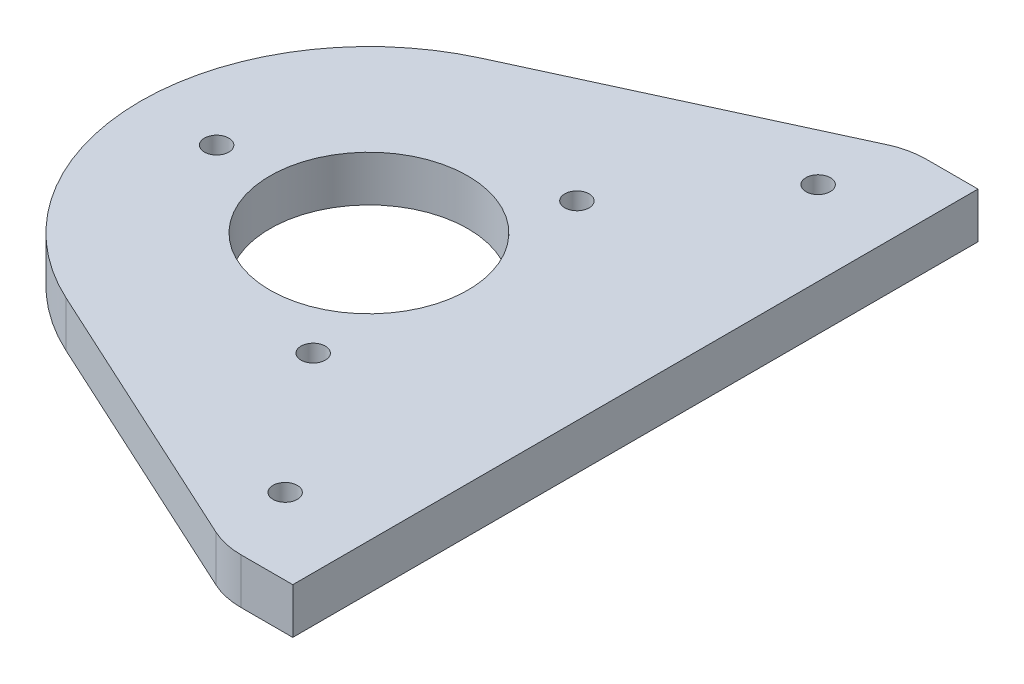
ISO-10303-21;
HEADER;
FILE_DESCRIPTION(('STEP AP214'),'2;1');
FILE_NAME('part.step','',(''),(''),'','','');
FILE_SCHEMA(('AUTOMOTIVE_DESIGN { 1 0 10303 214 1 1 1 1 }'));
ENDSEC;
DATA;
#1=APPLICATION_CONTEXT('core data for automotive mechanical design processes');
#2=APPLICATION_PROTOCOL_DEFINITION('international standard','automotive_design',2000,#1);
#3=PRODUCT_CONTEXT('',#1,'mechanical');
#4=PRODUCT('Part','Part','',(#3));
#5=PRODUCT_RELATED_PRODUCT_CATEGORY('part','',(#4));
#6=PRODUCT_DEFINITION_FORMATION('','',#4);
#7=PRODUCT_DEFINITION_CONTEXT('part definition',#1,'design');
#8=PRODUCT_DEFINITION('design','',#6,#7);
#9=PRODUCT_DEFINITION_SHAPE('','',#8);
#10=(LENGTH_UNIT() NAMED_UNIT(*) SI_UNIT(.MILLI.,.METRE.));
#11=(NAMED_UNIT(*) PLANE_ANGLE_UNIT() SI_UNIT($,.RADIAN.));
#12=(NAMED_UNIT(*) SI_UNIT($,.STERADIAN.) SOLID_ANGLE_UNIT());
#13=UNCERTAINTY_MEASURE_WITH_UNIT(LENGTH_MEASURE(1.E-05),#10,'distance_accuracy_value','');
#14=(GEOMETRIC_REPRESENTATION_CONTEXT(3) GLOBAL_UNCERTAINTY_ASSIGNED_CONTEXT((#13)) GLOBAL_UNIT_ASSIGNED_CONTEXT((#10,
#11,#12)) REPRESENTATION_CONTEXT('',''));
#15=CARTESIAN_POINT('',(0.,0.,0.));
#16=DIRECTION('',(0.,0.,1.));
#17=DIRECTION('',(1.,0.,0.));
#18=AXIS2_PLACEMENT_3D('',#15,#16,#17);
#19=CARTESIAN_POINT('',(-11.2261094095535,6.,0.));
#20=DIRECTION('',(0.,-1.,0.));
#21=DIRECTION('',(0.,0.,-1.));
#22=AXIS2_PLACEMENT_3D('',#19,#20,#21);
#23=CYLINDRICAL_SURFACE('',#22,30.);
#24=CARTESIAN_POINT('',(-11.2261094095535,0.,0.));
#25=DIRECTION('',(0.,1.,0.));
#26=DIRECTION('',(0.,0.,1.));
#27=AXIS2_PLACEMENT_3D('',#24,#25,#26);
#28=CIRCLE('',#27,30.);
#29=CARTESIAN_POINT('',(-23.7738905904465,0.,-27.2498291267382));
#30=VERTEX_POINT('',#29);
#31=CARTESIAN_POINT('',(-23.7738905904465,0.,27.2498291267382));
#32=VERTEX_POINT('',#31);
#33=EDGE_CURVE('E133',#30,#32,#28,.T.);
#34=ORIENTED_EDGE('',*,*,#33,.T.);
#35=DIRECTION('',(0.,-1.,0.));
#36=VECTOR('',#35,1.);
#37=CARTESIAN_POINT('',(-23.7738905904465,6.,27.2498291267382));
#38=LINE('',#37,#36);
#39=CARTESIAN_POINT('',(-23.7738905904465,6.,27.2498291267382));
#40=VERTEX_POINT('',#39);
#41=EDGE_CURVE('E114',#40,#32,#38,.T.);
#42=ORIENTED_EDGE('',*,*,#41,.F.);
#43=CARTESIAN_POINT('',(-11.2261094095535,6.,0.));
#44=DIRECTION('',(0.,1.,0.));
#45=DIRECTION('',(0.,0.,1.));
#46=AXIS2_PLACEMENT_3D('',#43,#44,#45);
#47=CIRCLE('',#46,30.);
#48=CARTESIAN_POINT('',(-23.7738905904465,6.,-27.2498291267382));
#49=VERTEX_POINT('',#48);
#50=EDGE_CURVE('E121',#49,#40,#47,.T.);
#51=ORIENTED_EDGE('',*,*,#50,.F.);
#52=DIRECTION('',(0.,-1.,0.));
#53=VECTOR('',#52,1.);
#54=CARTESIAN_POINT('',(-23.7738905904465,6.,-27.2498291267382));
#55=LINE('',#54,#53);
#56=EDGE_CURVE('E178',#49,#30,#55,.T.);
#57=ORIENTED_EDGE('',*,*,#56,.T.);
#58=EDGE_LOOP('',(#34,#42,#51,#57));
#59=FACE_BOUND('',#58,.T.);
#60=ADVANCED_FACE('F43',(#59),#23,.T.);
#61=CARTESIAN_POINT('',(-23.7738905904465,6.,27.2498291267382));
#62=DIRECTION('',(0.418259372696433,0.,-0.908327637557939));
#63=DIRECTION('',(-0.908327637557939,0.,-0.418259372696433));
#64=AXIS2_PLACEMENT_3D('',#61,#62,#63);
#65=PLANE('',#64);
#66=DIRECTION('',(0.908327637557939,0.,0.418259372696433));
#67=VECTOR('',#66,1.);
#68=CARTESIAN_POINT('',(-23.7738905904465,0.,27.2498291267382));
#69=LINE('',#68,#67);
#70=CARTESIAN_POINT('',(12.7830555765283,0.,44.0832763755794));
#71=VERTEX_POINT('',#70);
#72=EDGE_CURVE('E191',#32,#71,#69,.T.);
#73=ORIENTED_EDGE('',*,*,#72,.T.);
#74=DIRECTION('',(0.,-1.,0.));
#75=VECTOR('',#74,1.);
#76=CARTESIAN_POINT('',(12.7830555765283,6.,44.0832763755794));
#77=LINE('',#76,#75);
#78=CARTESIAN_POINT('',(12.7830555765283,6.,44.0832763755794));
#79=VERTEX_POINT('',#78);
#80=EDGE_CURVE('E117',#71,#79,#77,.F.);
#81=ORIENTED_EDGE('',*,*,#80,.T.);
#82=DIRECTION('',(0.908327637557939,0.,0.418259372696433));
#83=VECTOR('',#82,1.);
#84=CARTESIAN_POINT('',(-23.7738905904465,6.,27.2498291267382));
#85=LINE('',#84,#83);
#86=EDGE_CURVE('E109',#40,#79,#85,.T.);
#87=ORIENTED_EDGE('',*,*,#86,.F.);
#88=ORIENTED_EDGE('',*,*,#41,.T.);
#89=EDGE_LOOP('',(#73,#81,#87,#88));
#90=FACE_BOUND('',#89,.T.);
#91=ADVANCED_FACE('F112',(#90),#65,.F.);
#92=CARTESIAN_POINT('',(14.7738905904465,6.,45.));
#93=DIRECTION('',(0.,0.,-1.));
#94=DIRECTION('',(-1.,0.,0.));
#95=AXIS2_PLACEMENT_3D('',#92,#93,#94);
#96=PLANE('',#95);
#97=DIRECTION('',(1.,0.,0.));
#98=VECTOR('',#97,1.);
#99=CARTESIAN_POINT('',(14.7738905904465,6.,45.));
#100=LINE('',#99,#98);
#101=CARTESIAN_POINT('',(16.9656493034926,6.,45.));
#102=VERTEX_POINT('',#101);
#103=CARTESIAN_POINT('',(23.7738905904465,6.,45.));
#104=VERTEX_POINT('',#103);
#105=EDGE_CURVE('E120',#102,#104,#100,.T.);
#106=ORIENTED_EDGE('',*,*,#105,.F.);
#107=DIRECTION('',(0.,-1.,0.));
#108=VECTOR('',#107,1.);
#109=CARTESIAN_POINT('',(16.9656493034926,6.,45.));
#110=LINE('',#109,#108);
#111=CARTESIAN_POINT('',(16.9656493034926,0.,45.));
#112=VERTEX_POINT('',#111);
#113=EDGE_CURVE('E135',#102,#112,#110,.T.);
#114=ORIENTED_EDGE('',*,*,#113,.T.);
#115=DIRECTION('',(1.,0.,0.));
#116=VECTOR('',#115,1.);
#117=CARTESIAN_POINT('',(14.7738905904465,0.,45.));
#118=LINE('',#117,#116);
#119=CARTESIAN_POINT('',(23.7738905904465,0.,45.));
#120=VERTEX_POINT('',#119);
#121=EDGE_CURVE('E188',#112,#120,#118,.T.);
#122=ORIENTED_EDGE('',*,*,#121,.T.);
#123=DIRECTION('',(0.,-1.,0.));
#124=VECTOR('',#123,1.);
#125=CARTESIAN_POINT('',(23.7738905904465,6.,45.));
#126=LINE('',#125,#124);
#127=EDGE_CURVE('E136',#104,#120,#126,.T.);
#128=ORIENTED_EDGE('',*,*,#127,.F.);
#129=EDGE_LOOP('',(#106,#114,#122,#128));
#130=FACE_BOUND('',#129,.T.);
#131=ADVANCED_FACE('F291',(#130),#96,.F.);
#132=CARTESIAN_POINT('',(23.7738905904465,6.,-45.));
#133=DIRECTION('',(-1.,0.,0.));
#134=DIRECTION('',(0.,0.,1.));
#135=AXIS2_PLACEMENT_3D('',#132,#133,#134);
#136=PLANE('',#135);
#137=DIRECTION('',(0.,0.,-1.));
#138=VECTOR('',#137,1.);
#139=CARTESIAN_POINT('',(23.7738905904465,0.,-45.));
#140=LINE('',#139,#138);
#141=CARTESIAN_POINT('',(23.7738905904465,0.,-45.));
#142=VERTEX_POINT('',#141);
#143=EDGE_CURVE('E174',#120,#142,#140,.T.);
#144=ORIENTED_EDGE('',*,*,#143,.T.);
#145=DIRECTION('',(0.,-1.,0.));
#146=VECTOR('',#145,1.);
#147=CARTESIAN_POINT('',(23.7738905904465,6.,-45.));
#148=LINE('',#147,#146);
#149=CARTESIAN_POINT('',(23.7738905904465,6.,-45.));
#150=VERTEX_POINT('',#149);
#151=EDGE_CURVE('E144',#150,#142,#148,.T.);
#152=ORIENTED_EDGE('',*,*,#151,.F.);
#153=DIRECTION('',(0.,0.,-1.));
#154=VECTOR('',#153,1.);
#155=CARTESIAN_POINT('',(23.7738905904465,6.,-45.));
#156=LINE('',#155,#154);
#157=EDGE_CURVE('E203',#104,#150,#156,.T.);
#158=ORIENTED_EDGE('',*,*,#157,.F.);
#159=ORIENTED_EDGE('',*,*,#127,.T.);
#160=EDGE_LOOP('',(#144,#152,#158,#159));
#161=FACE_BOUND('',#160,.T.);
#162=ADVANCED_FACE('F308',(#161),#136,.F.);
#163=CARTESIAN_POINT('',(23.7738905904465,6.,-45.));
#164=DIRECTION('',(0.,0.,1.));
#165=DIRECTION('',(1.,0.,0.));
#166=AXIS2_PLACEMENT_3D('',#163,#164,#165);
#167=PLANE('',#166);
#168=DIRECTION('',(-1.,0.,0.));
#169=VECTOR('',#168,1.);
#170=CARTESIAN_POINT('',(23.7738905904465,0.,-45.));
#171=LINE('',#170,#169);
#172=CARTESIAN_POINT('',(16.9656493034926,0.,-45.));
#173=VERTEX_POINT('',#172);
#174=EDGE_CURVE('E171',#142,#173,#171,.T.);
#175=ORIENTED_EDGE('',*,*,#174,.T.);
#176=DIRECTION('',(0.,-1.,0.));
#177=VECTOR('',#176,1.);
#178=CARTESIAN_POINT('',(16.9656493034926,6.,-45.));
#179=LINE('',#178,#177);
#180=CARTESIAN_POINT('',(16.9656493034926,6.,-45.));
#181=VERTEX_POINT('',#180);
#182=EDGE_CURVE('E11',#173,#181,#179,.F.);
#183=ORIENTED_EDGE('',*,*,#182,.T.);
#184=DIRECTION('',(-1.,0.,0.));
#185=VECTOR('',#184,1.);
#186=CARTESIAN_POINT('',(23.7738905904465,6.,-45.));
#187=LINE('',#186,#185);
#188=EDGE_CURVE('E184',#150,#181,#187,.T.);
#189=ORIENTED_EDGE('',*,*,#188,.F.);
#190=ORIENTED_EDGE('',*,*,#151,.T.);
#191=EDGE_LOOP('',(#175,#183,#189,#190));
#192=FACE_BOUND('',#191,.T.);
#193=ADVANCED_FACE('F183',(#192),#167,.F.);
#194=CARTESIAN_POINT('',(14.7738905904465,6.,-45.));
#195=DIRECTION('',(0.418259372696433,0.,0.908327637557939));
#196=DIRECTION('',(0.908327637557939,0.,-0.418259372696433));
#197=AXIS2_PLACEMENT_3D('',#194,#195,#196);
#198=PLANE('',#197);
#199=DIRECTION('',(-0.908327637557939,0.,0.418259372696433));
#200=VECTOR('',#199,1.);
#201=CARTESIAN_POINT('',(14.7738905904465,6.,-45.));
#202=LINE('',#201,#200);
#203=CARTESIAN_POINT('',(12.7830555765283,6.,-44.0832763755794));
#204=VERTEX_POINT('',#203);
#205=EDGE_CURVE('E125',#204,#49,#202,.T.);
#206=ORIENTED_EDGE('',*,*,#205,.F.);
#207=DIRECTION('',(0.,-1.,0.));
#208=VECTOR('',#207,1.);
#209=CARTESIAN_POINT('',(12.7830555765283,6.,-44.0832763755794));
#210=LINE('',#209,#208);
#211=CARTESIAN_POINT('',(12.7830555765283,0.,-44.0832763755794));
#212=VERTEX_POINT('',#211);
#213=EDGE_CURVE('E52',#204,#212,#210,.T.);
#214=ORIENTED_EDGE('',*,*,#213,.T.);
#215=DIRECTION('',(-0.908327637557939,0.,0.418259372696433));
#216=VECTOR('',#215,1.);
#217=CARTESIAN_POINT('',(14.7738905904465,0.,-45.));
#218=LINE('',#217,#216);
#219=EDGE_CURVE('E130',#212,#30,#218,.T.);
#220=ORIENTED_EDGE('',*,*,#219,.T.);
#221=ORIENTED_EDGE('',*,*,#56,.F.);
#222=EDGE_LOOP('',(#206,#214,#220,#221));
#223=FACE_BOUND('',#222,.T.);
#224=ADVANCED_FACE('F164',(#223),#198,.F.);
#225=CARTESIAN_POINT('',(-11.2261094095535,6.,0.));
#226=DIRECTION('',(0.,1.,0.));
#227=DIRECTION('',(0.,0.,1.));
#228=AXIS2_PLACEMENT_3D('',#225,#226,#227);
#229=PLANE('',#228);
#230=CARTESIAN_POINT('',(12.7738905904465,6.,-35.));
#231=DIRECTION('',(0.,1.,0.));
#232=DIRECTION('',(0.,0.,1.));
#233=AXIS2_PLACEMENT_3D('',#230,#231,#232);
#234=CIRCLE('',#233,1.6);
#235=CARTESIAN_POINT('',(12.7738905904465,6.,-33.4));
#236=VERTEX_POINT('',#235);
#237=EDGE_CURVE('E244',#236,#236,#234,.T.);
#238=ORIENTED_EDGE('',*,*,#237,.F.);
#239=EDGE_LOOP('',(#238));
#240=FACE_BOUND('',#239,.T.);
#241=CARTESIAN_POINT('',(12.7738905904465,6.,35.));
#242=DIRECTION('',(0.,1.,0.));
#243=DIRECTION('',(0.,0.,-1.));
#244=AXIS2_PLACEMENT_3D('',#241,#242,#243);
#245=CIRCLE('',#244,1.6);
#246=CARTESIAN_POINT('',(12.7738905904465,6.,33.4));
#247=VERTEX_POINT('',#246);
#248=EDGE_CURVE('E240',#247,#247,#245,.T.);
#249=ORIENTED_EDGE('',*,*,#248,.F.);
#250=EDGE_LOOP('',(#249));
#251=FACE_BOUND('',#250,.T.);
#252=CARTESIAN_POINT('',(-1.2261094095535,6.,-17.3205080756888));
#253=DIRECTION('',(0.,1.,0.));
#254=DIRECTION('',(0.,0.,1.));
#255=AXIS2_PLACEMENT_3D('',#252,#253,#254);
#256=CIRCLE('',#255,1.6);
#257=CARTESIAN_POINT('',(-1.2261094095535,6.,-15.7205080756888));
#258=VERTEX_POINT('',#257);
#259=EDGE_CURVE('E216',#258,#258,#256,.T.);
#260=ORIENTED_EDGE('',*,*,#259,.F.);
#261=EDGE_LOOP('',(#260));
#262=FACE_BOUND('',#261,.T.);
#263=CARTESIAN_POINT('',(-1.22610940955351,6.,17.3205080756888));
#264=DIRECTION('',(0.,1.,0.));
#265=DIRECTION('',(0.,0.,1.));
#266=AXIS2_PLACEMENT_3D('',#263,#264,#265);
#267=CIRCLE('',#266,1.6);
#268=CARTESIAN_POINT('',(-1.22610940955351,6.,18.9205080756888));
#269=VERTEX_POINT('',#268);
#270=EDGE_CURVE('E226',#269,#269,#267,.T.);
#271=ORIENTED_EDGE('',*,*,#270,.F.);
#272=EDGE_LOOP('',(#271));
#273=FACE_BOUND('',#272,.T.);
#274=CARTESIAN_POINT('',(-31.2261094095535,6.,0.));
#275=DIRECTION('',(0.,1.,0.));
#276=DIRECTION('',(0.,0.,1.));
#277=AXIS2_PLACEMENT_3D('',#274,#275,#276);
#278=CIRCLE('',#277,1.6);
#279=CARTESIAN_POINT('',(-31.2261094095535,6.,1.6));
#280=VERTEX_POINT('',#279);
#281=EDGE_CURVE('E215',#280,#280,#278,.T.);
#282=ORIENTED_EDGE('',*,*,#281,.F.);
#283=EDGE_LOOP('',(#282));
#284=FACE_BOUND('',#283,.T.);
#285=CARTESIAN_POINT('',(-11.2261094095535,6.,0.));
#286=DIRECTION('',(0.,1.,0.));
#287=DIRECTION('',(0.,0.,1.));
#288=AXIS2_PLACEMENT_3D('',#285,#286,#287);
#289=CIRCLE('',#288,13.);
#290=CARTESIAN_POINT('',(-11.2261094095535,6.,13.));
#291=VERTEX_POINT('',#290);
#292=EDGE_CURVE('E211',#291,#291,#289,.T.);
#293=ORIENTED_EDGE('',*,*,#292,.F.);
#294=EDGE_LOOP('',(#293));
#295=FACE_BOUND('',#294,.T.);
#296=ORIENTED_EDGE('',*,*,#86,.T.);
#297=CARTESIAN_POINT('',(16.9656493034926,6.,35.));
#298=DIRECTION('',(0.,1.,0.));
#299=DIRECTION('',(0.,0.,1.));
#300=AXIS2_PLACEMENT_3D('',#297,#298,#299);
#301=CIRCLE('',#300,10.);
#302=EDGE_CURVE('E157',#79,#102,#301,.T.);
#303=ORIENTED_EDGE('',*,*,#302,.T.);
#304=ORIENTED_EDGE('',*,*,#105,.T.);
#305=ORIENTED_EDGE('',*,*,#157,.T.);
#306=ORIENTED_EDGE('',*,*,#188,.T.);
#307=CARTESIAN_POINT('',(16.9656493034926,6.,-35.));
#308=DIRECTION('',(0.,1.,0.));
#309=DIRECTION('',(0.,0.,1.));
#310=AXIS2_PLACEMENT_3D('',#307,#308,#309);
#311=CIRCLE('',#310,10.);
#312=EDGE_CURVE('E59',#181,#204,#311,.T.);
#313=ORIENTED_EDGE('',*,*,#312,.T.);
#314=ORIENTED_EDGE('',*,*,#205,.T.);
#315=ORIENTED_EDGE('',*,*,#50,.T.);
#316=EDGE_LOOP('',(#296,#303,#304,#305,#306,#313,#314,#315));
#317=FACE_BOUND('',#316,.T.);
#318=ADVANCED_FACE('F124',(#240,#251,#262,#273,#284,#295,#317),#229,.T.);
#319=CARTESIAN_POINT('',(-11.2261094095535,0.,0.));
#320=DIRECTION('',(0.,1.,0.));
#321=DIRECTION('',(0.,0.,1.));
#322=AXIS2_PLACEMENT_3D('',#319,#320,#321);
#323=PLANE('',#322);
#324=CARTESIAN_POINT('',(12.7738905904465,0.,-35.));
#325=DIRECTION('',(0.,1.,0.));
#326=DIRECTION('',(0.,0.,1.));
#327=AXIS2_PLACEMENT_3D('',#324,#325,#326);
#328=CIRCLE('',#327,1.6);
#329=CARTESIAN_POINT('',(12.7738905904465,0.,-33.4));
#330=VERTEX_POINT('',#329);
#331=EDGE_CURVE('E225',#330,#330,#328,.F.);
#332=ORIENTED_EDGE('',*,*,#331,.F.);
#333=EDGE_LOOP('',(#332));
#334=FACE_BOUND('',#333,.T.);
#335=CARTESIAN_POINT('',(12.7738905904465,0.,35.));
#336=DIRECTION('',(0.,1.,0.));
#337=DIRECTION('',(0.,0.,1.));
#338=AXIS2_PLACEMENT_3D('',#335,#336,#337);
#339=CIRCLE('',#338,1.6);
#340=CARTESIAN_POINT('',(12.7738905904465,0.,36.6));
#341=VERTEX_POINT('',#340);
#342=EDGE_CURVE('E245',#341,#341,#339,.F.);
#343=ORIENTED_EDGE('',*,*,#342,.F.);
#344=EDGE_LOOP('',(#343));
#345=FACE_BOUND('',#344,.T.);
#346=CARTESIAN_POINT('',(-1.2261094095535,0.,-17.3205080756888));
#347=DIRECTION('',(0.,1.,0.));
#348=DIRECTION('',(0.,0.,1.));
#349=AXIS2_PLACEMENT_3D('',#346,#347,#348);
#350=CIRCLE('',#349,1.6);
#351=CARTESIAN_POINT('',(-1.2261094095535,0.,-15.7205080756888));
#352=VERTEX_POINT('',#351);
#353=EDGE_CURVE('E221',#352,#352,#350,.F.);
#354=ORIENTED_EDGE('',*,*,#353,.F.);
#355=EDGE_LOOP('',(#354));
#356=FACE_BOUND('',#355,.T.);
#357=CARTESIAN_POINT('',(-1.22610940955351,0.,17.3205080756888));
#358=DIRECTION('',(0.,1.,0.));
#359=DIRECTION('',(0.,0.,1.));
#360=AXIS2_PLACEMENT_3D('',#357,#358,#359);
#361=CIRCLE('',#360,1.6);
#362=CARTESIAN_POINT('',(-1.22610940955351,0.,18.9205080756888));
#363=VERTEX_POINT('',#362);
#364=EDGE_CURVE('E220',#363,#363,#361,.F.);
#365=ORIENTED_EDGE('',*,*,#364,.F.);
#366=EDGE_LOOP('',(#365));
#367=FACE_BOUND('',#366,.T.);
#368=CARTESIAN_POINT('',(-31.2261094095535,0.,0.));
#369=DIRECTION('',(0.,1.,0.));
#370=DIRECTION('',(0.,0.,1.));
#371=AXIS2_PLACEMENT_3D('',#368,#369,#370);
#372=CIRCLE('',#371,1.6);
#373=CARTESIAN_POINT('',(-31.2261094095535,0.,1.6));
#374=VERTEX_POINT('',#373);
#375=EDGE_CURVE('E230',#374,#374,#372,.F.);
#376=ORIENTED_EDGE('',*,*,#375,.F.);
#377=EDGE_LOOP('',(#376));
#378=FACE_BOUND('',#377,.T.);
#379=CARTESIAN_POINT('',(-11.2261094095535,0.,0.));
#380=DIRECTION('',(0.,1.,0.));
#381=DIRECTION('',(0.,0.,1.));
#382=AXIS2_PLACEMENT_3D('',#379,#380,#381);
#383=CIRCLE('',#382,13.);
#384=CARTESIAN_POINT('',(-11.2261094095535,0.,13.));
#385=VERTEX_POINT('',#384);
#386=EDGE_CURVE('E198',#385,#385,#383,.F.);
#387=ORIENTED_EDGE('',*,*,#386,.F.);
#388=EDGE_LOOP('',(#387));
#389=FACE_BOUND('',#388,.T.);
#390=ORIENTED_EDGE('',*,*,#121,.F.);
#391=CARTESIAN_POINT('',(16.9656493034926,0.,35.));
#392=DIRECTION('',(0.,1.,0.));
#393=DIRECTION('',(0.,0.,1.));
#394=AXIS2_PLACEMENT_3D('',#391,#392,#393);
#395=CIRCLE('',#394,10.);
#396=EDGE_CURVE('E150',#112,#71,#395,.F.);
#397=ORIENTED_EDGE('',*,*,#396,.T.);
#398=ORIENTED_EDGE('',*,*,#72,.F.);
#399=ORIENTED_EDGE('',*,*,#33,.F.);
#400=ORIENTED_EDGE('',*,*,#219,.F.);
#401=CARTESIAN_POINT('',(16.9656493034926,0.,-35.));
#402=DIRECTION('',(0.,1.,0.));
#403=DIRECTION('',(0.,0.,1.));
#404=AXIS2_PLACEMENT_3D('',#401,#402,#403);
#405=CIRCLE('',#404,10.);
#406=EDGE_CURVE('E141',#212,#173,#405,.F.);
#407=ORIENTED_EDGE('',*,*,#406,.T.);
#408=ORIENTED_EDGE('',*,*,#174,.F.);
#409=ORIENTED_EDGE('',*,*,#143,.F.);
#410=EDGE_LOOP('',(#390,#397,#398,#399,#400,#407,#408,#409));
#411=FACE_BOUND('',#410,.T.);
#412=ADVANCED_FACE('F168',(#334,#345,#356,#367,#378,#389,#411),#323,.F.);
#413=CARTESIAN_POINT('',(-11.2261094095535,-36.7695526217005,0.));
#414=DIRECTION('',(0.,1.,0.));
#415=DIRECTION('',(0.,0.,1.));
#416=AXIS2_PLACEMENT_3D('',#413,#414,#415);
#417=CYLINDRICAL_SURFACE('',#416,13.);
#418=ORIENTED_EDGE('',*,*,#386,.T.);
#419=EDGE_LOOP('',(#418));
#420=FACE_BOUND('',#419,.T.);
#421=ORIENTED_EDGE('',*,*,#292,.T.);
#422=EDGE_LOOP('',(#421));
#423=FACE_BOUND('',#422,.T.);
#424=ADVANCED_FACE('F271',(#420,#423),#417,.F.);
#425=CARTESIAN_POINT('',(-31.2261094095535,-36.7695526217005,0.));
#426=DIRECTION('',(0.,1.,0.));
#427=DIRECTION('',(0.,0.,1.));
#428=AXIS2_PLACEMENT_3D('',#425,#426,#427);
#429=CYLINDRICAL_SURFACE('',#428,1.6);
#430=ORIENTED_EDGE('',*,*,#375,.T.);
#431=EDGE_LOOP('',(#430));
#432=FACE_BOUND('',#431,.T.);
#433=ORIENTED_EDGE('',*,*,#281,.T.);
#434=EDGE_LOOP('',(#433));
#435=FACE_BOUND('',#434,.T.);
#436=ADVANCED_FACE('F273',(#432,#435),#429,.F.);
#437=CARTESIAN_POINT('',(-1.22610940955351,-36.7695526217005,17.3205080756888));
#438=DIRECTION('',(0.,1.,0.));
#439=DIRECTION('',(0.,0.,1.));
#440=AXIS2_PLACEMENT_3D('',#437,#438,#439);
#441=CYLINDRICAL_SURFACE('',#440,1.6);
#442=ORIENTED_EDGE('',*,*,#364,.T.);
#443=EDGE_LOOP('',(#442));
#444=FACE_BOUND('',#443,.T.);
#445=ORIENTED_EDGE('',*,*,#270,.T.);
#446=EDGE_LOOP('',(#445));
#447=FACE_BOUND('',#446,.T.);
#448=ADVANCED_FACE('F280',(#444,#447),#441,.F.);
#449=CARTESIAN_POINT('',(-1.2261094095535,-36.7695526217005,-17.3205080756888));
#450=DIRECTION('',(0.,1.,0.));
#451=DIRECTION('',(0.,0.,1.));
#452=AXIS2_PLACEMENT_3D('',#449,#450,#451);
#453=CYLINDRICAL_SURFACE('',#452,1.6);
#454=ORIENTED_EDGE('',*,*,#353,.T.);
#455=EDGE_LOOP('',(#454));
#456=FACE_BOUND('',#455,.T.);
#457=ORIENTED_EDGE('',*,*,#259,.T.);
#458=EDGE_LOOP('',(#457));
#459=FACE_BOUND('',#458,.T.);
#460=ADVANCED_FACE('F296',(#456,#459),#453,.F.);
#461=CARTESIAN_POINT('',(16.9656493034926,6.,35.));
#462=DIRECTION('',(0.,-1.,0.));
#463=DIRECTION('',(0.,0.,-1.));
#464=AXIS2_PLACEMENT_3D('',#461,#462,#463);
#465=CYLINDRICAL_SURFACE('',#464,10.);
#466=ORIENTED_EDGE('',*,*,#302,.F.);
#467=ORIENTED_EDGE('',*,*,#80,.F.);
#468=ORIENTED_EDGE('',*,*,#396,.F.);
#469=ORIENTED_EDGE('',*,*,#113,.F.);
#470=EDGE_LOOP('',(#466,#467,#468,#469));
#471=FACE_BOUND('',#470,.T.);
#472=ADVANCED_FACE('F294',(#471),#465,.T.);
#473=CARTESIAN_POINT('',(16.9656493034926,6.,-35.));
#474=DIRECTION('',(0.,-1.,0.));
#475=DIRECTION('',(0.,0.,-1.));
#476=AXIS2_PLACEMENT_3D('',#473,#474,#475);
#477=CYLINDRICAL_SURFACE('',#476,10.);
#478=ORIENTED_EDGE('',*,*,#312,.F.);
#479=ORIENTED_EDGE('',*,*,#182,.F.);
#480=ORIENTED_EDGE('',*,*,#406,.F.);
#481=ORIENTED_EDGE('',*,*,#213,.F.);
#482=EDGE_LOOP('',(#478,#479,#480,#481));
#483=FACE_BOUND('',#482,.T.);
#484=ADVANCED_FACE('F45',(#483),#477,.T.);
#485=CARTESIAN_POINT('',(12.7738905904465,-4.52548339959391,35.));
#486=DIRECTION('',(0.,1.,0.));
#487=DIRECTION('',(0.,0.,1.));
#488=AXIS2_PLACEMENT_3D('',#485,#486,#487);
#489=CYLINDRICAL_SURFACE('',#488,1.6);
#490=ORIENTED_EDGE('',*,*,#342,.T.);
#491=EDGE_LOOP('',(#490));
#492=FACE_BOUND('',#491,.T.);
#493=ORIENTED_EDGE('',*,*,#248,.T.);
#494=EDGE_LOOP('',(#493));
#495=FACE_BOUND('',#494,.T.);
#496=ADVANCED_FACE('F302',(#492,#495),#489,.F.);
#497=CARTESIAN_POINT('',(12.7738905904465,-4.52548339959391,-35.));
#498=DIRECTION('',(0.,1.,0.));
#499=DIRECTION('',(0.,0.,1.));
#500=AXIS2_PLACEMENT_3D('',#497,#498,#499);
#501=CYLINDRICAL_SURFACE('',#500,1.6);
#502=ORIENTED_EDGE('',*,*,#331,.T.);
#503=EDGE_LOOP('',(#502));
#504=FACE_BOUND('',#503,.T.);
#505=ORIENTED_EDGE('',*,*,#237,.T.);
#506=EDGE_LOOP('',(#505));
#507=FACE_BOUND('',#506,.T.);
#508=ADVANCED_FACE('F256',(#504,#507),#501,.F.);
#509=CLOSED_SHELL('',(#60,#91,#131,#162,#193,#224,#318,#412,#424,#436,#448,#460,#472,#484,#496,#508));
#510=MANIFOLD_SOLID_BREP('B2',#509);
#511=ADVANCED_BREP_SHAPE_REPRESENTATION('',(#18,#510),#14);
#512=SHAPE_DEFINITION_REPRESENTATION(#9,#511);
ENDSEC;
END-ISO-10303-21;
